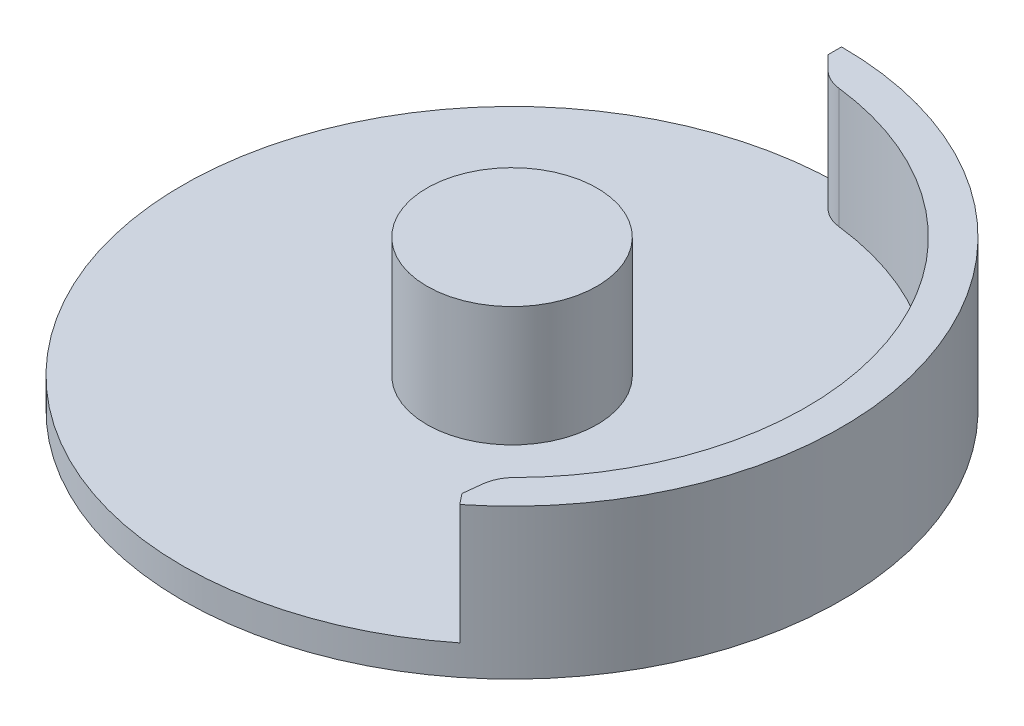
ISO-10303-21;
HEADER;
FILE_DESCRIPTION(('STEP AP214'),'2;1');
FILE_NAME('part.step','',(''),(''),'','','');
FILE_SCHEMA(('AUTOMOTIVE_DESIGN { 1 0 10303 214 1 1 1 1 }'));
ENDSEC;
DATA;
#1=APPLICATION_CONTEXT('core data for automotive mechanical design processes');
#2=APPLICATION_PROTOCOL_DEFINITION('international standard','automotive_design',2000,#1);
#3=PRODUCT_CONTEXT('',#1,'mechanical');
#4=PRODUCT('Part','Part','',(#3));
#5=PRODUCT_RELATED_PRODUCT_CATEGORY('part','',(#4));
#6=PRODUCT_DEFINITION_FORMATION('','',#4);
#7=PRODUCT_DEFINITION_CONTEXT('part definition',#1,'design');
#8=PRODUCT_DEFINITION('design','',#6,#7);
#9=PRODUCT_DEFINITION_SHAPE('','',#8);
#10=(LENGTH_UNIT() NAMED_UNIT(*) SI_UNIT(.MILLI.,.METRE.));
#11=(NAMED_UNIT(*) PLANE_ANGLE_UNIT() SI_UNIT($,.RADIAN.));
#12=(NAMED_UNIT(*) SI_UNIT($,.STERADIAN.) SOLID_ANGLE_UNIT());
#13=UNCERTAINTY_MEASURE_WITH_UNIT(LENGTH_MEASURE(1.E-05),#10,'distance_accuracy_value','');
#14=(GEOMETRIC_REPRESENTATION_CONTEXT(3) GLOBAL_UNCERTAINTY_ASSIGNED_CONTEXT((#13)) GLOBAL_UNIT_ASSIGNED_CONTEXT((#10,
#11,#12)) REPRESENTATION_CONTEXT('',''));
#15=CARTESIAN_POINT('',(0.,0.,0.));
#16=DIRECTION('',(0.,0.,1.));
#17=DIRECTION('',(1.,0.,0.));
#18=AXIS2_PLACEMENT_3D('',#15,#16,#17);
#19=CARTESIAN_POINT('',(0.,2.5,0.));
#20=DIRECTION('',(0.,1.,0.));
#21=DIRECTION('',(0.,0.,1.));
#22=AXIS2_PLACEMENT_3D('',#19,#20,#21);
#23=PLANE('',#22);
#24=CARTESIAN_POINT('',(0.,2.5,0.));
#25=DIRECTION('',(0.,1.,0.));
#26=DIRECTION('',(0.,0.,1.));
#27=AXIS2_PLACEMENT_3D('',#24,#25,#26);
#28=CIRCLE('',#27,7.1);
#29=CARTESIAN_POINT('',(0.,2.5,7.1));
#30=VERTEX_POINT('',#29);
#31=EDGE_CURVE('E158',#30,#30,#28,.T.);
#32=ORIENTED_EDGE('',*,*,#31,.F.);
#33=EDGE_LOOP('',(#32));
#34=FACE_BOUND('',#33,.T.);
#35=CARTESIAN_POINT('',(0.,2.5,0.));
#36=DIRECTION('',(0.,1.,0.));
#37=DIRECTION('',(0.,0.,1.));
#38=AXIS2_PLACEMENT_3D('',#35,#36,#37);
#39=CIRCLE('',#38,27.5);
#40=CARTESIAN_POINT('',(0.,2.5,-27.5));
#41=VERTEX_POINT('',#40);
#42=CARTESIAN_POINT('',(17.1433267710824,2.5,21.5024730489283));
#43=VERTEX_POINT('',#42);
#44=EDGE_CURVE('E163',#41,#43,#39,.T.);
#45=ORIENTED_EDGE('',*,*,#44,.T.);
#46=DIRECTION('',(0.623393700766632,0.,0.781908110870122));
#47=VECTOR('',#46,1.);
#48=CARTESIAN_POINT('',(15.3167832278362,2.5,19.2114822840789));
#49=LINE('',#48,#47);
#50=CARTESIAN_POINT('',(16.4388918892161,2.5,20.6189168836451));
#51=VERTEX_POINT('',#50);
#52=EDGE_CURVE('E124',#51,#43,#49,.T.);
#53=ORIENTED_EDGE('',*,*,#52,.F.);
#54=DIRECTION('',(-0.112086614299962,0.,0.993698440622089));
#55=VECTOR('',#54,1.);
#56=CARTESIAN_POINT('',(16.4388918892161,2.5,20.6189168836451));
#57=LINE('',#56,#55);
#58=CARTESIAN_POINT('',(16.6150832471428,2.5,19.0569009487686));
#59=VERTEX_POINT('',#58);
#60=EDGE_CURVE('E180',#51,#59,#57,.F.);
#61=ORIENTED_EDGE('',*,*,#60,.T.);
#62=CARTESIAN_POINT('',(19.5961785690091,2.5,19.3931607916685));
#63=DIRECTION('',(0.,1.,0.));
#64=DIRECTION('',(0.,0.,1.));
#65=AXIS2_PLACEMENT_3D('',#62,#63,#64);
#66=CIRCLE('',#65,3.);
#67=CARTESIAN_POINT('',(17.4638414015435,2.5,17.2829147860462));
#68=VERTEX_POINT('',#67);
#69=EDGE_CURVE('E50',#59,#68,#66,.F.);
#70=ORIENTED_EDGE('',*,*,#69,.T.);
#71=CARTESIAN_POINT('',(0.,2.5,0.));
#72=DIRECTION('',(0.,-1.,0.));
#73=DIRECTION('',(0.,0.,-1.));
#74=AXIS2_PLACEMENT_3D('',#71,#72,#73);
#75=CIRCLE('',#74,24.57);
#76=CARTESIAN_POINT('',(2.88105903030861,2.5,-24.4004999715964));
#77=VERTEX_POINT('',#76);
#78=EDGE_CURVE('E142',#77,#68,#75,.T.);
#79=ORIENTED_EDGE('',*,*,#78,.F.);
#80=CARTESIAN_POINT('',(3.23283668968695,2.5,-27.3798039974324));
#81=DIRECTION('',(0.,1.,0.));
#82=DIRECTION('',(0.,0.,1.));
#83=AXIS2_PLACEMENT_3D('',#80,#81,#82);
#84=CIRCLE('',#83,3.);
#85=CARTESIAN_POINT('',(1.1115163461273,2.5,-25.2584836538727));
#86=VERTEX_POINT('',#85);
#87=EDGE_CURVE('E11',#77,#86,#84,.F.);
#88=ORIENTED_EDGE('',*,*,#87,.T.);
#89=DIRECTION('',(0.707106781186547,0.,0.707106781186548));
#90=VECTOR('',#89,1.);
#91=CARTESIAN_POINT('',(1.87136994594577,2.5,-24.4986300540543));
#92=LINE('',#91,#90);
#93=CARTESIAN_POINT('',(0.,2.5,-26.37));
#94=VERTEX_POINT('',#93);
#95=EDGE_CURVE('E183',#86,#94,#92,.F.);
#96=ORIENTED_EDGE('',*,*,#95,.T.);
#97=DIRECTION('',(0.,0.,1.));
#98=VECTOR('',#97,1.);
#99=CARTESIAN_POINT('',(0.,2.5,-24.57));
#100=LINE('',#99,#98);
#101=EDGE_CURVE('E148',#41,#94,#100,.T.);
#102=ORIENTED_EDGE('',*,*,#101,.F.);
#103=EDGE_LOOP('',(#45,#53,#61,#70,#79,#88,#96,#102));
#104=FACE_BOUND('',#103,.T.);
#105=ADVANCED_FACE('F41',(#34,#104),#23,.T.);
#106=CARTESIAN_POINT('',(0.,2.5,0.));
#107=DIRECTION('',(0.,-1.,0.));
#108=DIRECTION('',(0.,0.,-1.));
#109=AXIS2_PLACEMENT_3D('',#106,#107,#108);
#110=CYLINDRICAL_SURFACE('',#109,27.5);
#111=ORIENTED_EDGE('',*,*,#44,.F.);
#112=DIRECTION('',(0.,-1.,0.));
#113=VECTOR('',#112,1.);
#114=CARTESIAN_POINT('',(0.,12.5,-27.5));
#115=LINE('',#114,#113);
#116=CARTESIAN_POINT('',(0.,12.5,-27.5));
#117=VERTEX_POINT('',#116);
#118=EDGE_CURVE('E130',#117,#41,#115,.T.);
#119=ORIENTED_EDGE('',*,*,#118,.F.);
#120=CARTESIAN_POINT('',(0.,12.5,0.));
#121=DIRECTION('',(0.,1.,0.));
#122=DIRECTION('',(0.,0.,-1.));
#123=AXIS2_PLACEMENT_3D('',#120,#121,#122);
#124=CIRCLE('',#123,27.5);
#125=CARTESIAN_POINT('',(17.1433267710824,12.5,21.5024730489283));
#126=VERTEX_POINT('',#125);
#127=EDGE_CURVE('E111',#126,#117,#124,.T.);
#128=ORIENTED_EDGE('',*,*,#127,.F.);
#129=DIRECTION('',(0.,-1.,0.));
#130=VECTOR('',#129,1.);
#131=CARTESIAN_POINT('',(17.1433267710824,12.5,21.5024730489283));
#132=LINE('',#131,#130);
#133=EDGE_CURVE('E121',#126,#43,#132,.T.);
#134=ORIENTED_EDGE('',*,*,#133,.T.);
#135=EDGE_LOOP('',(#111,#119,#128,#134));
#136=FACE_BOUND('',#135,.T.);
#137=CARTESIAN_POINT('',(0.,0.,0.));
#138=DIRECTION('',(0.,1.,0.));
#139=DIRECTION('',(0.,0.,1.));
#140=AXIS2_PLACEMENT_3D('',#137,#138,#139);
#141=CIRCLE('',#140,27.5);
#142=CARTESIAN_POINT('',(0.,0.,27.5));
#143=VERTEX_POINT('',#142);
#144=EDGE_CURVE('E157',#143,#143,#141,.T.);
#145=ORIENTED_EDGE('',*,*,#144,.T.);
#146=EDGE_LOOP('',(#145));
#147=FACE_BOUND('',#146,.T.);
#148=ADVANCED_FACE('F132',(#136,#147),#110,.T.);
#149=CARTESIAN_POINT('',(0.,0.,0.));
#150=DIRECTION('',(0.,1.,0.));
#151=DIRECTION('',(0.,0.,1.));
#152=AXIS2_PLACEMENT_3D('',#149,#150,#151);
#153=PLANE('',#152);
#154=ORIENTED_EDGE('',*,*,#144,.F.);
#155=EDGE_LOOP('',(#154));
#156=FACE_BOUND('',#155,.T.);
#157=ADVANCED_FACE('F234',(#156),#153,.F.);
#158=CARTESIAN_POINT('',(0.,12.5,0.));
#159=DIRECTION('',(0.,-1.,0.));
#160=DIRECTION('',(0.,0.,-1.));
#161=AXIS2_PLACEMENT_3D('',#158,#159,#160);
#162=CYLINDRICAL_SURFACE('',#161,7.1);
#163=CARTESIAN_POINT('',(0.,12.5,0.));
#164=DIRECTION('',(0.,1.,0.));
#165=DIRECTION('',(0.,0.,1.));
#166=AXIS2_PLACEMENT_3D('',#163,#164,#165);
#167=CIRCLE('',#166,7.1);
#168=CARTESIAN_POINT('',(0.,12.5,7.1));
#169=VERTEX_POINT('',#168);
#170=EDGE_CURVE('E129',#169,#169,#167,.T.);
#171=ORIENTED_EDGE('',*,*,#170,.F.);
#172=EDGE_LOOP('',(#171));
#173=FACE_BOUND('',#172,.T.);
#174=ORIENTED_EDGE('',*,*,#31,.T.);
#175=EDGE_LOOP('',(#174));
#176=FACE_BOUND('',#175,.T.);
#177=ADVANCED_FACE('F239',(#173,#176),#162,.T.);
#178=CARTESIAN_POINT('',(0.,12.5,0.));
#179=DIRECTION('',(0.,1.,0.));
#180=DIRECTION('',(0.,0.,1.));
#181=AXIS2_PLACEMENT_3D('',#178,#179,#180);
#182=PLANE('',#181);
#183=ORIENTED_EDGE('',*,*,#170,.T.);
#184=EDGE_LOOP('',(#183));
#185=FACE_BOUND('',#184,.T.);
#186=ADVANCED_FACE('F303',(#185),#182,.T.);
#187=CARTESIAN_POINT('',(0.,12.5,0.));
#188=DIRECTION('',(0.,-1.,0.));
#189=DIRECTION('',(0.,0.,-1.));
#190=AXIS2_PLACEMENT_3D('',#187,#188,#189);
#191=CYLINDRICAL_SURFACE('',#190,24.57);
#192=ORIENTED_EDGE('',*,*,#78,.T.);
#193=DIRECTION('',(0.,-1.,0.));
#194=VECTOR('',#193,1.);
#195=CARTESIAN_POINT('',(17.4638414015435,12.5,17.2829147860462));
#196=LINE('',#195,#194);
#197=CARTESIAN_POINT('',(17.4638414015435,12.5,17.2829147860462));
#198=VERTEX_POINT('',#197);
#199=EDGE_CURVE('E190',#68,#198,#196,.F.);
#200=ORIENTED_EDGE('',*,*,#199,.T.);
#201=CARTESIAN_POINT('',(0.,12.5,0.));
#202=DIRECTION('',(0.,-1.,0.));
#203=DIRECTION('',(0.,0.,-1.));
#204=AXIS2_PLACEMENT_3D('',#201,#202,#203);
#205=CIRCLE('',#204,24.57);
#206=CARTESIAN_POINT('',(2.88105903030861,12.5,-24.4004999715964));
#207=VERTEX_POINT('',#206);
#208=EDGE_CURVE('E118',#207,#198,#205,.T.);
#209=ORIENTED_EDGE('',*,*,#208,.F.);
#210=DIRECTION('',(0.,-1.,0.));
#211=VECTOR('',#210,1.);
#212=CARTESIAN_POINT('',(2.88105903030861,12.5,-24.4004999715964));
#213=LINE('',#212,#211);
#214=EDGE_CURVE('E186',#207,#77,#213,.T.);
#215=ORIENTED_EDGE('',*,*,#214,.T.);
#216=EDGE_LOOP('',(#192,#200,#209,#215));
#217=FACE_BOUND('',#216,.T.);
#218=ADVANCED_FACE('F209',(#217),#191,.F.);
#219=CARTESIAN_POINT('',(15.3167832278362,12.5,19.2114822840789));
#220=DIRECTION('',(0.781908110870122,0.,-0.623393700766632));
#221=DIRECTION('',(-0.623393700766632,0.,-0.781908110870122));
#222=AXIS2_PLACEMENT_3D('',#219,#220,#221);
#223=PLANE('',#222);
#224=DIRECTION('',(0.623393700766632,0.,0.781908110870122));
#225=VECTOR('',#224,1.);
#226=CARTESIAN_POINT('',(15.3167832278362,12.5,19.2114822840789));
#227=LINE('',#226,#225);
#228=CARTESIAN_POINT('',(16.4388918892161,12.5,20.6189168836451));
#229=VERTEX_POINT('',#228);
#230=EDGE_CURVE('E105',#229,#126,#227,.T.);
#231=ORIENTED_EDGE('',*,*,#230,.F.);
#232=DIRECTION('',(0.,-1.,0.));
#233=VECTOR('',#232,1.);
#234=CARTESIAN_POINT('',(16.4388918892161,12.5,20.6189168836451));
#235=LINE('',#234,#233);
#236=EDGE_CURVE('E162',#229,#51,#235,.T.);
#237=ORIENTED_EDGE('',*,*,#236,.T.);
#238=ORIENTED_EDGE('',*,*,#52,.T.);
#239=ORIENTED_EDGE('',*,*,#133,.F.);
#240=EDGE_LOOP('',(#231,#237,#238,#239));
#241=FACE_BOUND('',#240,.T.);
#242=ADVANCED_FACE('F122',(#241),#223,.F.);
#243=CARTESIAN_POINT('',(0.,12.5,-24.57));
#244=DIRECTION('',(1.,0.,0.));
#245=DIRECTION('',(0.,0.,-1.));
#246=AXIS2_PLACEMENT_3D('',#243,#244,#245);
#247=PLANE('',#246);
#248=ORIENTED_EDGE('',*,*,#101,.T.);
#249=DIRECTION('',(0.,1.,0.));
#250=VECTOR('',#249,1.);
#251=CARTESIAN_POINT('',(0.,12.5,-26.37));
#252=LINE('',#251,#250);
#253=CARTESIAN_POINT('',(0.,12.5,-26.37));
#254=VERTEX_POINT('',#253);
#255=EDGE_CURVE('E177',#94,#254,#252,.T.);
#256=ORIENTED_EDGE('',*,*,#255,.T.);
#257=DIRECTION('',(0.,0.,1.));
#258=VECTOR('',#257,1.);
#259=CARTESIAN_POINT('',(0.,12.5,-24.57));
#260=LINE('',#259,#258);
#261=EDGE_CURVE('E136',#117,#254,#260,.T.);
#262=ORIENTED_EDGE('',*,*,#261,.F.);
#263=ORIENTED_EDGE('',*,*,#118,.T.);
#264=EDGE_LOOP('',(#248,#256,#262,#263));
#265=FACE_BOUND('',#264,.T.);
#266=ADVANCED_FACE('F217',(#265),#247,.F.);
#267=CARTESIAN_POINT('',(0.,12.5,0.));
#268=DIRECTION('',(0.,-1.,0.));
#269=DIRECTION('',(0.,0.,-1.));
#270=AXIS2_PLACEMENT_3D('',#267,#268,#269);
#271=PLANE('',#270);
#272=ORIENTED_EDGE('',*,*,#208,.T.);
#273=CARTESIAN_POINT('',(19.5961785690091,12.5,19.3931607916685));
#274=DIRECTION('',(0.,-1.,0.));
#275=DIRECTION('',(0.,0.,-1.));
#276=AXIS2_PLACEMENT_3D('',#273,#274,#275);
#277=CIRCLE('',#276,3.);
#278=CARTESIAN_POINT('',(16.6150832471428,12.5,19.0569009487686));
#279=VERTEX_POINT('',#278);
#280=EDGE_CURVE('E197',#198,#279,#277,.F.);
#281=ORIENTED_EDGE('',*,*,#280,.T.);
#282=DIRECTION('',(0.112086614299962,0.,-0.993698440622089));
#283=VECTOR('',#282,1.);
#284=CARTESIAN_POINT('',(16.4388918892161,12.5,20.6189168836451));
#285=LINE('',#284,#283);
#286=EDGE_CURVE('E113',#279,#229,#285,.F.);
#287=ORIENTED_EDGE('',*,*,#286,.T.);
#288=ORIENTED_EDGE('',*,*,#230,.T.);
#289=ORIENTED_EDGE('',*,*,#127,.T.);
#290=ORIENTED_EDGE('',*,*,#261,.T.);
#291=DIRECTION('',(-0.707106781186547,0.,-0.707106781186548));
#292=VECTOR('',#291,1.);
#293=CARTESIAN_POINT('',(1.87136994594577,12.5,-24.4986300540543));
#294=LINE('',#293,#292);
#295=CARTESIAN_POINT('',(1.1115163461273,12.5,-25.2584836538727));
#296=VERTEX_POINT('',#295);
#297=EDGE_CURVE('E171',#254,#296,#294,.F.);
#298=ORIENTED_EDGE('',*,*,#297,.T.);
#299=CARTESIAN_POINT('',(3.23283668968695,12.5,-27.3798039974324));
#300=DIRECTION('',(0.,-1.,0.));
#301=DIRECTION('',(0.,0.,-1.));
#302=AXIS2_PLACEMENT_3D('',#299,#300,#301);
#303=CIRCLE('',#302,3.);
#304=EDGE_CURVE('E194',#296,#207,#303,.F.);
#305=ORIENTED_EDGE('',*,*,#304,.T.);
#306=EDGE_LOOP('',(#272,#281,#287,#288,#289,#290,#298,#305));
#307=FACE_BOUND('',#306,.T.);
#308=ADVANCED_FACE('F108',(#307),#271,.F.);
#309=CARTESIAN_POINT('',(16.4388918892161,12.5,20.6189168836451));
#310=DIRECTION('',(0.993698440622089,0.,0.112086614299962));
#311=DIRECTION('',(0.,-1.,0.));
#312=AXIS2_PLACEMENT_3D('',#309,#310,#311);
#313=PLANE('',#312);
#314=ORIENTED_EDGE('',*,*,#286,.F.);
#315=DIRECTION('',(0.,-1.,0.));
#316=VECTOR('',#315,1.);
#317=CARTESIAN_POINT('',(16.6150832471428,2.5,19.0569009487686));
#318=LINE('',#317,#316);
#319=EDGE_CURVE('E63',#279,#59,#318,.T.);
#320=ORIENTED_EDGE('',*,*,#319,.T.);
#321=ORIENTED_EDGE('',*,*,#60,.F.);
#322=ORIENTED_EDGE('',*,*,#236,.F.);
#323=EDGE_LOOP('',(#314,#320,#321,#322));
#324=FACE_BOUND('',#323,.T.);
#325=ADVANCED_FACE('F213',(#324),#313,.F.);
#326=CARTESIAN_POINT('',(1.87136994594577,12.5,-24.4986300540543));
#327=DIRECTION('',(0.707106781186548,0.,-0.707106781186547));
#328=DIRECTION('',(0.,-1.,0.));
#329=AXIS2_PLACEMENT_3D('',#326,#327,#328);
#330=PLANE('',#329);
#331=ORIENTED_EDGE('',*,*,#95,.F.);
#332=DIRECTION('',(0.,-1.,0.));
#333=VECTOR('',#332,1.);
#334=CARTESIAN_POINT('',(1.1115163461273,12.5,-25.2584836538727));
#335=LINE('',#334,#333);
#336=EDGE_CURVE('E202',#86,#296,#335,.F.);
#337=ORIENTED_EDGE('',*,*,#336,.T.);
#338=ORIENTED_EDGE('',*,*,#297,.F.);
#339=ORIENTED_EDGE('',*,*,#255,.F.);
#340=EDGE_LOOP('',(#331,#337,#338,#339));
#341=FACE_BOUND('',#340,.T.);
#342=ADVANCED_FACE('F220',(#341),#330,.F.);
#343=CARTESIAN_POINT('',(19.5961785690091,12.5,19.3931607916685));
#344=DIRECTION('',(0.,-1.,0.));
#345=DIRECTION('',(0.,0.,-1.));
#346=AXIS2_PLACEMENT_3D('',#343,#344,#345);
#347=CYLINDRICAL_SURFACE('',#346,3.);
#348=ORIENTED_EDGE('',*,*,#69,.F.);
#349=ORIENTED_EDGE('',*,*,#319,.F.);
#350=ORIENTED_EDGE('',*,*,#280,.F.);
#351=ORIENTED_EDGE('',*,*,#199,.F.);
#352=EDGE_LOOP('',(#348,#349,#350,#351));
#353=FACE_BOUND('',#352,.T.);
#354=ADVANCED_FACE('F212',(#353),#347,.T.);
#355=CARTESIAN_POINT('',(3.23283668968695,12.5,-27.3798039974324));
#356=DIRECTION('',(0.,-1.,0.));
#357=DIRECTION('',(0.,0.,-1.));
#358=AXIS2_PLACEMENT_3D('',#355,#356,#357);
#359=CYLINDRICAL_SURFACE('',#358,3.);
#360=ORIENTED_EDGE('',*,*,#304,.F.);
#361=ORIENTED_EDGE('',*,*,#336,.F.);
#362=ORIENTED_EDGE('',*,*,#87,.F.);
#363=ORIENTED_EDGE('',*,*,#214,.F.);
#364=EDGE_LOOP('',(#360,#361,#362,#363));
#365=FACE_BOUND('',#364,.T.);
#366=ADVANCED_FACE('F43',(#365),#359,.T.);
#367=CLOSED_SHELL('',(#105,#148,#157,#177,#186,#218,#242,#266,#308,#325,#342,#354,#366));
#368=MANIFOLD_SOLID_BREP('B2',#367);
#369=ADVANCED_BREP_SHAPE_REPRESENTATION('',(#18,#368),#14);
#370=SHAPE_DEFINITION_REPRESENTATION(#9,#369);
ENDSEC;
END-ISO-10303-21;
